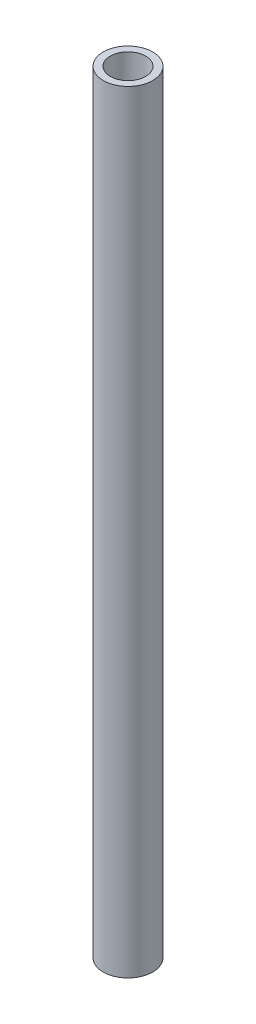
ISO-10303-21;
HEADER;
FILE_DESCRIPTION(('STEP AP214'),'2;1');
FILE_NAME('part.step','',(''),(''),'','','');
FILE_SCHEMA(('AUTOMOTIVE_DESIGN { 1 0 10303 214 1 1 1 1 }'));
ENDSEC;
DATA;
#1=APPLICATION_CONTEXT('core data for automotive mechanical design processes');
#2=APPLICATION_PROTOCOL_DEFINITION('international standard','automotive_design',2000,#1);
#3=PRODUCT_CONTEXT('',#1,'mechanical');
#4=PRODUCT('Part','Part','',(#3));
#5=PRODUCT_RELATED_PRODUCT_CATEGORY('part','',(#4));
#6=PRODUCT_DEFINITION_FORMATION('','',#4);
#7=PRODUCT_DEFINITION_CONTEXT('part definition',#1,'design');
#8=PRODUCT_DEFINITION('design','',#6,#7);
#9=PRODUCT_DEFINITION_SHAPE('','',#8);
#10=(LENGTH_UNIT() NAMED_UNIT(*) SI_UNIT(.MILLI.,.METRE.));
#11=(NAMED_UNIT(*) PLANE_ANGLE_UNIT() SI_UNIT($,.RADIAN.));
#12=(NAMED_UNIT(*) SI_UNIT($,.STERADIAN.) SOLID_ANGLE_UNIT());
#13=UNCERTAINTY_MEASURE_WITH_UNIT(LENGTH_MEASURE(1.E-05),#10,'distance_accuracy_value','');
#14=(GEOMETRIC_REPRESENTATION_CONTEXT(3) GLOBAL_UNCERTAINTY_ASSIGNED_CONTEXT((#13)) GLOBAL_UNIT_ASSIGNED_CONTEXT((#10,
#11,#12)) REPRESENTATION_CONTEXT('',''));
#15=CARTESIAN_POINT('',(0.,0.,0.));
#16=DIRECTION('',(0.,0.,1.));
#17=DIRECTION('',(1.,0.,0.));
#18=AXIS2_PLACEMENT_3D('',#15,#16,#17);
#19=CARTESIAN_POINT('',(0.,60.,0.));
#20=DIRECTION('',(0.,-1.,0.));
#21=DIRECTION('',(0.,0.,-1.));
#22=AXIS2_PLACEMENT_3D('',#19,#20,#21);
#23=CYLINDRICAL_SURFACE('',#22,1.925);
#24=CARTESIAN_POINT('',(0.,60.,0.));
#25=DIRECTION('',(0.,1.,0.));
#26=DIRECTION('',(0.,0.,1.));
#27=AXIS2_PLACEMENT_3D('',#24,#25,#26);
#28=CIRCLE('',#27,1.925);
#29=CARTESIAN_POINT('',(0.,60.,1.925));
#30=VERTEX_POINT('',#29);
#31=EDGE_CURVE('E10',#30,#30,#28,.T.);
#32=ORIENTED_EDGE('',*,*,#31,.F.);
#33=EDGE_LOOP('',(#32));
#34=FACE_BOUND('',#33,.T.);
#35=CARTESIAN_POINT('',(0.,0.,0.));
#36=DIRECTION('',(0.,1.,0.));
#37=DIRECTION('',(0.,0.,1.));
#38=AXIS2_PLACEMENT_3D('',#35,#36,#37);
#39=CIRCLE('',#38,1.925);
#40=CARTESIAN_POINT('',(0.,0.,1.925));
#41=VERTEX_POINT('',#40);
#42=EDGE_CURVE('E39',#41,#41,#39,.T.);
#43=ORIENTED_EDGE('',*,*,#42,.T.);
#44=EDGE_LOOP('',(#43));
#45=FACE_BOUND('',#44,.T.);
#46=ADVANCED_FACE('F36',(#34,#45),#23,.T.);
#47=CARTESIAN_POINT('',(0.,60.,0.));
#48=DIRECTION('',(0.,1.,0.));
#49=DIRECTION('',(0.,0.,1.));
#50=AXIS2_PLACEMENT_3D('',#47,#48,#49);
#51=PLANE('',#50);
#52=CARTESIAN_POINT('',(0.,60.,0.));
#53=DIRECTION('',(0.,1.,0.));
#54=DIRECTION('',(0.,0.,1.));
#55=AXIS2_PLACEMENT_3D('',#52,#53,#54);
#56=CIRCLE('',#55,1.375);
#57=CARTESIAN_POINT('',(0.,60.,1.375));
#58=VERTEX_POINT('',#57);
#59=EDGE_CURVE('E48',#58,#58,#56,.T.);
#60=ORIENTED_EDGE('',*,*,#59,.F.);
#61=EDGE_LOOP('',(#60));
#62=FACE_BOUND('',#61,.T.);
#63=ORIENTED_EDGE('',*,*,#31,.T.);
#64=EDGE_LOOP('',(#63));
#65=FACE_BOUND('',#64,.T.);
#66=ADVANCED_FACE('F72',(#62,#65),#51,.T.);
#67=CARTESIAN_POINT('',(0.,0.,0.));
#68=DIRECTION('',(0.,1.,0.));
#69=DIRECTION('',(0.,0.,1.));
#70=AXIS2_PLACEMENT_3D('',#67,#68,#69);
#71=PLANE('',#70);
#72=CARTESIAN_POINT('',(0.,0.,0.));
#73=DIRECTION('',(0.,1.,0.));
#74=DIRECTION('',(0.,0.,1.));
#75=AXIS2_PLACEMENT_3D('',#72,#73,#74);
#76=CIRCLE('',#75,1.375);
#77=CARTESIAN_POINT('',(0.,0.,1.375));
#78=VERTEX_POINT('',#77);
#79=EDGE_CURVE('E54',#78,#78,#76,.T.);
#80=ORIENTED_EDGE('',*,*,#79,.T.);
#81=EDGE_LOOP('',(#80));
#82=FACE_BOUND('',#81,.T.);
#83=ORIENTED_EDGE('',*,*,#42,.F.);
#84=EDGE_LOOP('',(#83));
#85=FACE_BOUND('',#84,.T.);
#86=ADVANCED_FACE('F78',(#82,#85),#71,.F.);
#87=CARTESIAN_POINT('',(0.,49.,0.));
#88=DIRECTION('',(0.,1.,0.));
#89=DIRECTION('',(0.,0.,1.));
#90=AXIS2_PLACEMENT_3D('',#87,#88,#89);
#91=CYLINDRICAL_SURFACE('',#90,1.375);
#92=CARTESIAN_POINT('',(0.,49.,0.));
#93=DIRECTION('',(0.,1.,0.));
#94=DIRECTION('',(0.,0.,1.));
#95=AXIS2_PLACEMENT_3D('',#92,#93,#94);
#96=CIRCLE('',#95,1.375);
#97=CARTESIAN_POINT('',(0.,49.,1.375));
#98=VERTEX_POINT('',#97);
#99=EDGE_CURVE('E46',#98,#98,#96,.T.);
#100=ORIENTED_EDGE('',*,*,#99,.F.);
#101=EDGE_LOOP('',(#100));
#102=FACE_BOUND('',#101,.T.);
#103=ORIENTED_EDGE('',*,*,#59,.T.);
#104=EDGE_LOOP('',(#103));
#105=FACE_BOUND('',#104,.T.);
#106=ADVANCED_FACE('F85',(#102,#105),#91,.F.);
#107=CARTESIAN_POINT('',(0.,49.,0.));
#108=DIRECTION('',(0.,1.,0.));
#109=DIRECTION('',(0.,0.,1.));
#110=AXIS2_PLACEMENT_3D('',#107,#108,#109);
#111=PLANE('',#110);
#112=ORIENTED_EDGE('',*,*,#99,.T.);
#113=EDGE_LOOP('',(#112));
#114=FACE_BOUND('',#113,.T.);
#115=ADVANCED_FACE('F69',(#114),#111,.T.);
#116=CARTESIAN_POINT('',(0.,11.,0.));
#117=DIRECTION('',(0.,-1.,0.));
#118=DIRECTION('',(0.,0.,-1.));
#119=AXIS2_PLACEMENT_3D('',#116,#117,#118);
#120=CYLINDRICAL_SURFACE('',#119,1.375);
#121=CARTESIAN_POINT('',(0.,11.,0.));
#122=DIRECTION('',(0.,1.,0.));
#123=DIRECTION('',(0.,0.,1.));
#124=AXIS2_PLACEMENT_3D('',#121,#122,#123);
#125=CIRCLE('',#124,1.375);
#126=CARTESIAN_POINT('',(0.,11.,1.375));
#127=VERTEX_POINT('',#126);
#128=EDGE_CURVE('E51',#127,#127,#125,.T.);
#129=ORIENTED_EDGE('',*,*,#128,.T.);
#130=EDGE_LOOP('',(#129));
#131=FACE_BOUND('',#130,.T.);
#132=ORIENTED_EDGE('',*,*,#79,.F.);
#133=EDGE_LOOP('',(#132));
#134=FACE_BOUND('',#133,.T.);
#135=ADVANCED_FACE('F60',(#131,#134),#120,.F.);
#136=CARTESIAN_POINT('',(0.,11.,0.));
#137=DIRECTION('',(0.,1.,0.));
#138=DIRECTION('',(0.,0.,1.));
#139=AXIS2_PLACEMENT_3D('',#136,#137,#138);
#140=PLANE('',#139);
#141=ORIENTED_EDGE('',*,*,#128,.F.);
#142=EDGE_LOOP('',(#141));
#143=FACE_BOUND('',#142,.T.);
#144=ADVANCED_FACE('F63',(#143),#140,.F.);
#145=CLOSED_SHELL('',(#46,#66,#86,#106,#115,#135,#144));
#146=MANIFOLD_SOLID_BREP('B2',#145);
#147=ADVANCED_BREP_SHAPE_REPRESENTATION('',(#18,#146),#14);
#148=SHAPE_DEFINITION_REPRESENTATION(#9,#147);
ENDSEC;
END-ISO-10303-21;
